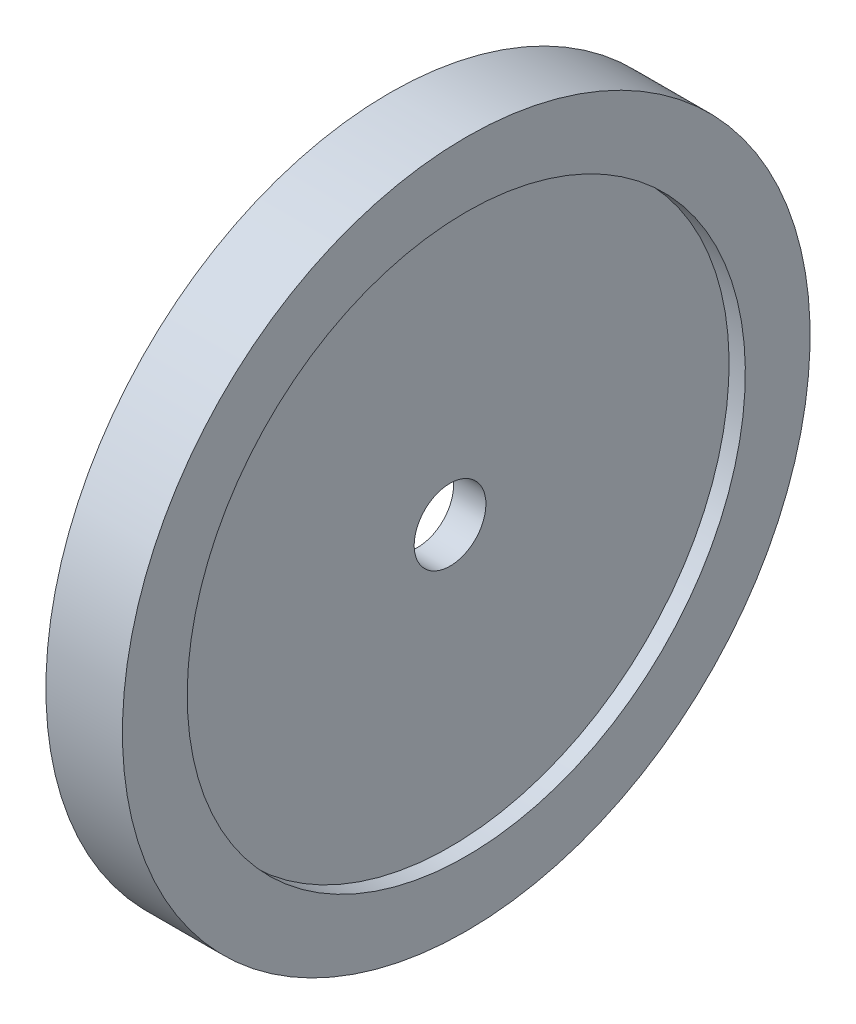
ISO-10303-21;
HEADER;
FILE_DESCRIPTION(('STEP AP214'),'2;1');
FILE_NAME('part.step','',(''),(''),'','','');
FILE_SCHEMA(('AUTOMOTIVE_DESIGN { 1 0 10303 214 1 1 1 1 }'));
ENDSEC;
DATA;
#1=APPLICATION_CONTEXT('core data for automotive mechanical design processes');
#2=APPLICATION_PROTOCOL_DEFINITION('international standard','automotive_design',2000,#1);
#3=PRODUCT_CONTEXT('',#1,'mechanical');
#4=PRODUCT('Part','Part','',(#3));
#5=PRODUCT_RELATED_PRODUCT_CATEGORY('part','',(#4));
#6=PRODUCT_DEFINITION_FORMATION('','',#4);
#7=PRODUCT_DEFINITION_CONTEXT('part definition',#1,'design');
#8=PRODUCT_DEFINITION('design','',#6,#7);
#9=PRODUCT_DEFINITION_SHAPE('','',#8);
#10=(LENGTH_UNIT() NAMED_UNIT(*) SI_UNIT(.MILLI.,.METRE.));
#11=(NAMED_UNIT(*) PLANE_ANGLE_UNIT() SI_UNIT($,.RADIAN.));
#12=(NAMED_UNIT(*) SI_UNIT($,.STERADIAN.) SOLID_ANGLE_UNIT());
#13=UNCERTAINTY_MEASURE_WITH_UNIT(LENGTH_MEASURE(1.E-05),#10,'distance_accuracy_value','');
#14=(GEOMETRIC_REPRESENTATION_CONTEXT(3) GLOBAL_UNCERTAINTY_ASSIGNED_CONTEXT((#13)) GLOBAL_UNIT_ASSIGNED_CONTEXT((#10,
#11,#12)) REPRESENTATION_CONTEXT('',''));
#15=CARTESIAN_POINT('',(0.,0.,0.));
#16=DIRECTION('',(0.,0.,1.));
#17=DIRECTION('',(1.,0.,0.));
#18=AXIS2_PLACEMENT_3D('',#15,#16,#17);
#19=CARTESIAN_POINT('',(0.,0.,0.));
#20=DIRECTION('',(-1.,0.,0.));
#21=DIRECTION('',(0.,-1.,0.));
#22=AXIS2_PLACEMENT_3D('',#19,#20,#21);
#23=PLANE('',#22);
#24=CARTESIAN_POINT('',(0.,0.,0.));
#25=DIRECTION('',(-1.,0.,0.));
#26=DIRECTION('',(0.,-1.,0.));
#27=AXIS2_PLACEMENT_3D('',#24,#25,#26);
#28=CIRCLE('',#27,17.5);
#29=CARTESIAN_POINT('',(0.,-17.5,0.));
#30=VERTEX_POINT('',#29);
#31=EDGE_CURVE('E62',#30,#30,#28,.T.);
#32=ORIENTED_EDGE('',*,*,#31,.F.);
#33=EDGE_LOOP('',(#32));
#34=FACE_BOUND('',#33,.T.);
#35=CARTESIAN_POINT('',(0.,0.,0.));
#36=DIRECTION('',(1.,0.,0.));
#37=DIRECTION('',(0.,1.,0.));
#38=AXIS2_PLACEMENT_3D('',#35,#36,#37);
#39=CIRCLE('',#38,28.);
#40=CARTESIAN_POINT('',(0.,28.,0.));
#41=VERTEX_POINT('',#40);
#42=EDGE_CURVE('E39',#41,#41,#39,.T.);
#43=ORIENTED_EDGE('',*,*,#42,.F.);
#44=EDGE_LOOP('',(#43));
#45=FACE_BOUND('',#44,.T.);
#46=ADVANCED_FACE('F33',(#34,#45),#23,.T.);
#47=CARTESIAN_POINT('',(3.25000000000001,0.,0.));
#48=DIRECTION('',(1.,0.,0.));
#49=DIRECTION('',(0.,1.,0.));
#50=AXIS2_PLACEMENT_3D('',#47,#48,#49);
#51=CYLINDRICAL_SURFACE('',#50,28.);
#52=ORIENTED_EDGE('',*,*,#42,.T.);
#53=EDGE_LOOP('',(#52));
#54=FACE_BOUND('',#53,.T.);
#55=CARTESIAN_POINT('',(-2.80000000000001,0.,0.));
#56=DIRECTION('',(1.,0.,0.));
#57=DIRECTION('',(0.,1.,0.));
#58=AXIS2_PLACEMENT_3D('',#55,#56,#57);
#59=CIRCLE('',#58,28.);
#60=CARTESIAN_POINT('',(-2.8,28.,0.));
#61=VERTEX_POINT('',#60);
#62=EDGE_CURVE('E43',#61,#61,#59,.T.);
#63=ORIENTED_EDGE('',*,*,#62,.F.);
#64=EDGE_LOOP('',(#63));
#65=FACE_BOUND('',#64,.T.);
#66=ADVANCED_FACE('F91',(#54,#65),#51,.F.);
#67=CARTESIAN_POINT('',(-2.8,28.,0.));
#68=DIRECTION('',(-1.,0.,0.));
#69=DIRECTION('',(0.,-1.,0.));
#70=AXIS2_PLACEMENT_3D('',#67,#68,#69);
#71=PLANE('',#70);
#72=ORIENTED_EDGE('',*,*,#62,.T.);
#73=EDGE_LOOP('',(#72));
#74=FACE_BOUND('',#73,.T.);
#75=CARTESIAN_POINT('',(-2.80000000000001,0.,0.));
#76=DIRECTION('',(1.,0.,0.));
#77=DIRECTION('',(0.,1.,0.));
#78=AXIS2_PLACEMENT_3D('',#75,#76,#77);
#79=CIRCLE('',#78,34.5);
#80=CARTESIAN_POINT('',(-2.8,34.5,0.));
#81=VERTEX_POINT('',#80);
#82=EDGE_CURVE('E47',#81,#81,#79,.T.);
#83=ORIENTED_EDGE('',*,*,#82,.F.);
#84=EDGE_LOOP('',(#83));
#85=FACE_BOUND('',#84,.T.);
#86=ADVANCED_FACE('F96',(#74,#85),#71,.T.);
#87=CARTESIAN_POINT('',(3.25000000000001,0.,0.));
#88=DIRECTION('',(1.,0.,0.));
#89=DIRECTION('',(0.,1.,0.));
#90=AXIS2_PLACEMENT_3D('',#87,#88,#89);
#91=CYLINDRICAL_SURFACE('',#90,34.5);
#92=ORIENTED_EDGE('',*,*,#82,.T.);
#93=EDGE_LOOP('',(#92));
#94=FACE_BOUND('',#93,.T.);
#95=CARTESIAN_POINT('',(4.87999999999998,0.,0.));
#96=DIRECTION('',(1.,0.,0.));
#97=DIRECTION('',(0.,1.,0.));
#98=AXIS2_PLACEMENT_3D('',#95,#96,#97);
#99=CIRCLE('',#98,34.5);
#100=CARTESIAN_POINT('',(4.88,34.5,0.));
#101=VERTEX_POINT('',#100);
#102=EDGE_CURVE('E52',#101,#101,#99,.T.);
#103=ORIENTED_EDGE('',*,*,#102,.F.);
#104=EDGE_LOOP('',(#103));
#105=FACE_BOUND('',#104,.T.);
#106=ADVANCED_FACE('F125',(#94,#105),#91,.T.);
#107=CARTESIAN_POINT('',(4.88,34.5,0.));
#108=DIRECTION('',(1.,0.,0.));
#109=DIRECTION('',(0.,1.,0.));
#110=AXIS2_PLACEMENT_3D('',#107,#108,#109);
#111=PLANE('',#110);
#112=ORIENTED_EDGE('',*,*,#102,.T.);
#113=EDGE_LOOP('',(#112));
#114=FACE_BOUND('',#113,.T.);
#115=CARTESIAN_POINT('',(4.87999999999999,0.,0.));
#116=DIRECTION('',(1.,0.,0.));
#117=DIRECTION('',(0.,1.,0.));
#118=AXIS2_PLACEMENT_3D('',#115,#116,#117);
#119=CIRCLE('',#118,28.);
#120=CARTESIAN_POINT('',(4.88,28.,0.));
#121=VERTEX_POINT('',#120);
#122=EDGE_CURVE('E55',#121,#121,#119,.T.);
#123=ORIENTED_EDGE('',*,*,#122,.F.);
#124=EDGE_LOOP('',(#123));
#125=FACE_BOUND('',#124,.T.);
#126=ADVANCED_FACE('F121',(#114,#125),#111,.T.);
#127=CARTESIAN_POINT('',(3.25000000000001,0.,0.));
#128=DIRECTION('',(1.,0.,0.));
#129=DIRECTION('',(0.,1.,0.));
#130=AXIS2_PLACEMENT_3D('',#127,#128,#129);
#131=CYLINDRICAL_SURFACE('',#130,28.);
#132=ORIENTED_EDGE('',*,*,#122,.T.);
#133=EDGE_LOOP('',(#132));
#134=FACE_BOUND('',#133,.T.);
#135=CARTESIAN_POINT('',(3.24999999999999,0.,0.));
#136=DIRECTION('',(1.,0.,0.));
#137=DIRECTION('',(0.,1.,0.));
#138=AXIS2_PLACEMENT_3D('',#135,#136,#137);
#139=CIRCLE('',#138,28.);
#140=CARTESIAN_POINT('',(3.25,28.,0.));
#141=VERTEX_POINT('',#140);
#142=EDGE_CURVE('E58',#141,#141,#139,.T.);
#143=ORIENTED_EDGE('',*,*,#142,.F.);
#144=EDGE_LOOP('',(#143));
#145=FACE_BOUND('',#144,.T.);
#146=ADVANCED_FACE('F117',(#134,#145),#131,.F.);
#147=CARTESIAN_POINT('',(3.25000000000001,28.,0.));
#148=DIRECTION('',(1.,0.,0.));
#149=DIRECTION('',(0.,1.,0.));
#150=AXIS2_PLACEMENT_3D('',#147,#148,#149);
#151=PLANE('',#150);
#152=CARTESIAN_POINT('',(3.25,0.,0.));
#153=DIRECTION('',(1.,0.,0.));
#154=DIRECTION('',(0.,1.,0.));
#155=AXIS2_PLACEMENT_3D('',#152,#153,#154);
#156=CIRCLE('',#155,3.6);
#157=CARTESIAN_POINT('',(3.25,3.6,0.));
#158=VERTEX_POINT('',#157);
#159=EDGE_CURVE('E70',#158,#158,#156,.F.);
#160=ORIENTED_EDGE('',*,*,#159,.T.);
#161=EDGE_LOOP('',(#160));
#162=FACE_BOUND('',#161,.T.);
#163=ORIENTED_EDGE('',*,*,#142,.T.);
#164=EDGE_LOOP('',(#163));
#165=FACE_BOUND('',#164,.T.);
#166=ADVANCED_FACE('F110',(#162,#165),#151,.T.);
#167=CARTESIAN_POINT('',(-1.5,0.,0.));
#168=DIRECTION('',(-1.,0.,0.));
#169=DIRECTION('',(0.,-1.,0.));
#170=AXIS2_PLACEMENT_3D('',#167,#168,#169);
#171=PLANE('',#170);
#172=CARTESIAN_POINT('',(-1.5,0.,0.));
#173=DIRECTION('',(-1.,0.,0.));
#174=DIRECTION('',(0.,-1.,0.));
#175=AXIS2_PLACEMENT_3D('',#172,#173,#174);
#176=CIRCLE('',#175,17.5);
#177=CARTESIAN_POINT('',(-1.5,-17.5,0.));
#178=VERTEX_POINT('',#177);
#179=EDGE_CURVE('E61',#178,#178,#176,.T.);
#180=ORIENTED_EDGE('',*,*,#179,.T.);
#181=EDGE_LOOP('',(#180));
#182=FACE_BOUND('',#181,.T.);
#183=CARTESIAN_POINT('',(-1.5,0.,0.));
#184=DIRECTION('',(-1.,0.,0.));
#185=DIRECTION('',(0.,-1.,0.));
#186=AXIS2_PLACEMENT_3D('',#183,#184,#185);
#187=CIRCLE('',#186,11.5);
#188=CARTESIAN_POINT('',(-1.5,-11.5,0.));
#189=VERTEX_POINT('',#188);
#190=EDGE_CURVE('E65',#189,#189,#187,.T.);
#191=ORIENTED_EDGE('',*,*,#190,.F.);
#192=EDGE_LOOP('',(#191));
#193=FACE_BOUND('',#192,.T.);
#194=ADVANCED_FACE('F102',(#182,#193),#171,.T.);
#195=CARTESIAN_POINT('',(-1.5,0.,0.));
#196=DIRECTION('',(1.,0.,0.));
#197=DIRECTION('',(0.,1.,0.));
#198=AXIS2_PLACEMENT_3D('',#195,#196,#197);
#199=CYLINDRICAL_SURFACE('',#198,17.5);
#200=ORIENTED_EDGE('',*,*,#179,.F.);
#201=EDGE_LOOP('',(#200));
#202=FACE_BOUND('',#201,.T.);
#203=ORIENTED_EDGE('',*,*,#31,.T.);
#204=EDGE_LOOP('',(#203));
#205=FACE_BOUND('',#204,.T.);
#206=ADVANCED_FACE('F100',(#202,#205),#199,.T.);
#207=CARTESIAN_POINT('',(-1.5,0.,0.));
#208=DIRECTION('',(1.,0.,0.));
#209=DIRECTION('',(0.,1.,0.));
#210=AXIS2_PLACEMENT_3D('',#207,#208,#209);
#211=CYLINDRICAL_SURFACE('',#210,11.5);
#212=ORIENTED_EDGE('',*,*,#190,.T.);
#213=EDGE_LOOP('',(#212));
#214=FACE_BOUND('',#213,.T.);
#215=CARTESIAN_POINT('',(0.,0.,0.));
#216=DIRECTION('',(-1.,0.,0.));
#217=DIRECTION('',(0.,-1.,0.));
#218=AXIS2_PLACEMENT_3D('',#215,#216,#217);
#219=CIRCLE('',#218,11.5);
#220=CARTESIAN_POINT('',(0.,-11.5,0.));
#221=VERTEX_POINT('',#220);
#222=EDGE_CURVE('E10',#221,#221,#219,.F.);
#223=ORIENTED_EDGE('',*,*,#222,.T.);
#224=EDGE_LOOP('',(#223));
#225=FACE_BOUND('',#224,.T.);
#226=ADVANCED_FACE('F87',(#214,#225),#211,.F.);
#227=CARTESIAN_POINT('',(0.,0.,0.));
#228=DIRECTION('',(1.,0.,0.));
#229=DIRECTION('',(0.,0.,-1.));
#230=AXIS2_PLACEMENT_3D('',#227,#228,#229);
#231=CIRCLE('',#230,3.6);
#232=CARTESIAN_POINT('',(0.,0.,-3.6));
#233=VERTEX_POINT('',#232);
#234=EDGE_CURVE('E73',#233,#233,#231,.T.);
#235=ORIENTED_EDGE('',*,*,#234,.T.);
#236=EDGE_LOOP('',(#235));
#237=FACE_BOUND('',#236,.T.);
#238=ORIENTED_EDGE('',*,*,#222,.F.);
#239=EDGE_LOOP('',(#238));
#240=FACE_BOUND('',#239,.T.);
#241=ADVANCED_FACE('F77',(#237,#240),#23,.T.);
#242=CARTESIAN_POINT('',(4.88,0.,0.));
#243=DIRECTION('',(-1.,0.,0.));
#244=DIRECTION('',(0.,0.,1.));
#245=AXIS2_PLACEMENT_3D('',#242,#243,#244);
#246=CYLINDRICAL_SURFACE('',#245,3.6);
#247=ORIENTED_EDGE('',*,*,#159,.F.);
#248=EDGE_LOOP('',(#247));
#249=FACE_BOUND('',#248,.T.);
#250=ORIENTED_EDGE('',*,*,#234,.F.);
#251=EDGE_LOOP('',(#250));
#252=FACE_BOUND('',#251,.T.);
#253=ADVANCED_FACE('F80',(#249,#252),#246,.F.);
#254=CLOSED_SHELL('',(#46,#66,#86,#106,#126,#146,#166,#194,#206,#226,#241,#253));
#255=MANIFOLD_SOLID_BREP('B2',#254);
#256=ADVANCED_BREP_SHAPE_REPRESENTATION('',(#18,#255),#14);
#257=SHAPE_DEFINITION_REPRESENTATION(#9,#256);
ENDSEC;
END-ISO-10303-21;
